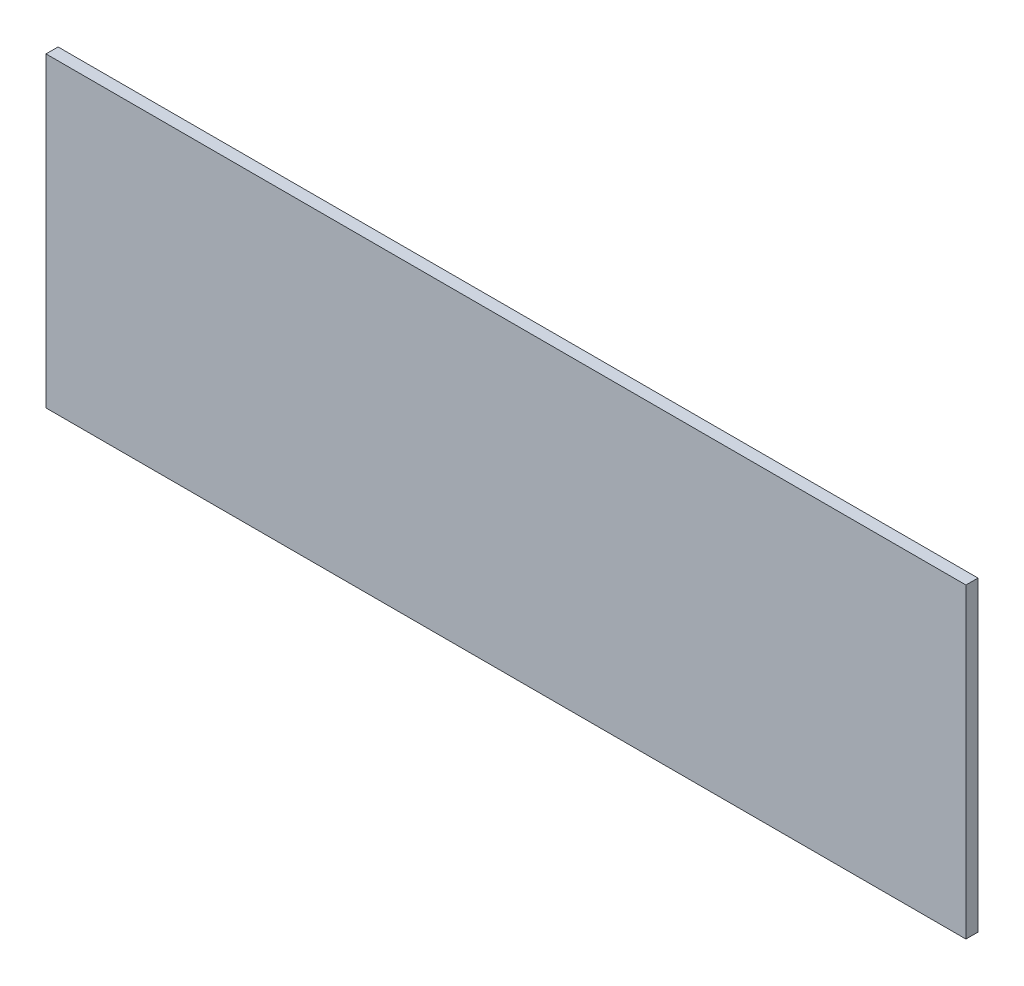
ISO-10303-21;
HEADER;
FILE_DESCRIPTION(('STEP AP214'),'2;1');
FILE_NAME('part.step','',(''),(''),'','','');
FILE_SCHEMA(('AUTOMOTIVE_DESIGN { 1 0 10303 214 1 1 1 1 }'));
ENDSEC;
DATA;
#1=APPLICATION_CONTEXT('core data for automotive mechanical design processes');
#2=APPLICATION_PROTOCOL_DEFINITION('international standard','automotive_design',2000,#1);
#3=PRODUCT_CONTEXT('',#1,'mechanical');
#4=PRODUCT('Part','Part','',(#3));
#5=PRODUCT_RELATED_PRODUCT_CATEGORY('part','',(#4));
#6=PRODUCT_DEFINITION_FORMATION('','',#4);
#7=PRODUCT_DEFINITION_CONTEXT('part definition',#1,'design');
#8=PRODUCT_DEFINITION('design','',#6,#7);
#9=PRODUCT_DEFINITION_SHAPE('','',#8);
#10=(LENGTH_UNIT() NAMED_UNIT(*) SI_UNIT(.MILLI.,.METRE.));
#11=(NAMED_UNIT(*) PLANE_ANGLE_UNIT() SI_UNIT($,.RADIAN.));
#12=(NAMED_UNIT(*) SI_UNIT($,.STERADIAN.) SOLID_ANGLE_UNIT());
#13=UNCERTAINTY_MEASURE_WITH_UNIT(LENGTH_MEASURE(1.E-05),#10,'distance_accuracy_value','');
#14=(GEOMETRIC_REPRESENTATION_CONTEXT(3) GLOBAL_UNCERTAINTY_ASSIGNED_CONTEXT((#13)) GLOBAL_UNIT_ASSIGNED_CONTEXT((#10,
#11,#12)) REPRESENTATION_CONTEXT('',''));
#15=CARTESIAN_POINT('',(0.,0.,0.));
#16=DIRECTION('',(0.,0.,1.));
#17=DIRECTION('',(1.,0.,0.));
#18=AXIS2_PLACEMENT_3D('',#15,#16,#17);
#19=CARTESIAN_POINT('',(0.,0.,1.));
#20=DIRECTION('',(1.,0.,0.));
#21=DIRECTION('',(0.,0.,-1.));
#22=AXIS2_PLACEMENT_3D('',#19,#20,#21);
#23=PLANE('',#22);
#24=DIRECTION('',(0.,-1.,0.));
#25=VECTOR('',#24,1.);
#26=CARTESIAN_POINT('',(0.,0.,0.));
#27=LINE('',#26,#25);
#28=CARTESIAN_POINT('',(0.,25.4,0.));
#29=VERTEX_POINT('',#28);
#30=CARTESIAN_POINT('',(0.,0.,0.));
#31=VERTEX_POINT('',#30);
#32=EDGE_CURVE('E98',#29,#31,#27,.T.);
#33=ORIENTED_EDGE('',*,*,#32,.T.);
#34=DIRECTION('',(0.,0.,-1.));
#35=VECTOR('',#34,1.);
#36=CARTESIAN_POINT('',(0.,0.,1.));
#37=LINE('',#36,#35);
#38=CARTESIAN_POINT('',(0.,0.,1.));
#39=VERTEX_POINT('',#38);
#40=EDGE_CURVE('E11',#39,#31,#37,.T.);
#41=ORIENTED_EDGE('',*,*,#40,.F.);
#42=DIRECTION('',(0.,-1.,0.));
#43=VECTOR('',#42,1.);
#44=CARTESIAN_POINT('',(0.,0.,1.));
#45=LINE('',#44,#43);
#46=CARTESIAN_POINT('',(0.,25.4,1.));
#47=VERTEX_POINT('',#46);
#48=EDGE_CURVE('E86',#47,#39,#45,.T.);
#49=ORIENTED_EDGE('',*,*,#48,.F.);
#50=DIRECTION('',(0.,0.,-1.));
#51=VECTOR('',#50,1.);
#52=CARTESIAN_POINT('',(0.,25.4,1.));
#53=LINE('',#52,#51);
#54=EDGE_CURVE('E94',#47,#29,#53,.T.);
#55=ORIENTED_EDGE('',*,*,#54,.T.);
#56=EDGE_LOOP('',(#33,#41,#49,#55));
#57=FACE_BOUND('',#56,.T.);
#58=ADVANCED_FACE('F35',(#57),#23,.F.);
#59=CARTESIAN_POINT('',(0.,0.,1.));
#60=DIRECTION('',(0.,1.,0.));
#61=DIRECTION('',(0.,0.,1.));
#62=AXIS2_PLACEMENT_3D('',#59,#60,#61);
#63=PLANE('',#62);
#64=DIRECTION('',(1.,0.,0.));
#65=VECTOR('',#64,1.);
#66=CARTESIAN_POINT('',(0.,0.,0.));
#67=LINE('',#66,#65);
#68=CARTESIAN_POINT('',(76.2,0.,0.));
#69=VERTEX_POINT('',#68);
#70=EDGE_CURVE('E90',#31,#69,#67,.T.);
#71=ORIENTED_EDGE('',*,*,#70,.T.);
#72=DIRECTION('',(0.,0.,-1.));
#73=VECTOR('',#72,1.);
#74=CARTESIAN_POINT('',(76.2,0.,1.));
#75=LINE('',#74,#73);
#76=CARTESIAN_POINT('',(76.2,0.,1.));
#77=VERTEX_POINT('',#76);
#78=EDGE_CURVE('E43',#77,#69,#75,.T.);
#79=ORIENTED_EDGE('',*,*,#78,.F.);
#80=DIRECTION('',(1.,0.,0.));
#81=VECTOR('',#80,1.);
#82=CARTESIAN_POINT('',(0.,0.,1.));
#83=LINE('',#82,#81);
#84=EDGE_CURVE('E81',#39,#77,#83,.T.);
#85=ORIENTED_EDGE('',*,*,#84,.F.);
#86=ORIENTED_EDGE('',*,*,#40,.T.);
#87=EDGE_LOOP('',(#71,#79,#85,#86));
#88=FACE_BOUND('',#87,.T.);
#89=ADVANCED_FACE('F89',(#88),#63,.F.);
#90=CARTESIAN_POINT('',(76.2,0.,1.));
#91=DIRECTION('',(-1.,0.,0.));
#92=DIRECTION('',(0.,0.,1.));
#93=AXIS2_PLACEMENT_3D('',#90,#91,#92);
#94=PLANE('',#93);
#95=DIRECTION('',(0.,1.,0.));
#96=VECTOR('',#95,1.);
#97=CARTESIAN_POINT('',(76.2,0.,0.));
#98=LINE('',#97,#96);
#99=CARTESIAN_POINT('',(76.2,25.4,0.));
#100=VERTEX_POINT('',#99);
#101=EDGE_CURVE('E68',#69,#100,#98,.T.);
#102=ORIENTED_EDGE('',*,*,#101,.T.);
#103=DIRECTION('',(0.,0.,-1.));
#104=VECTOR('',#103,1.);
#105=CARTESIAN_POINT('',(76.2,25.4,1.));
#106=LINE('',#105,#104);
#107=CARTESIAN_POINT('',(76.2,25.4,1.));
#108=VERTEX_POINT('',#107);
#109=EDGE_CURVE('E91',#108,#100,#106,.T.);
#110=ORIENTED_EDGE('',*,*,#109,.F.);
#111=DIRECTION('',(0.,1.,0.));
#112=VECTOR('',#111,1.);
#113=CARTESIAN_POINT('',(76.2,0.,1.));
#114=LINE('',#113,#112);
#115=EDGE_CURVE('E84',#77,#108,#114,.T.);
#116=ORIENTED_EDGE('',*,*,#115,.F.);
#117=ORIENTED_EDGE('',*,*,#78,.T.);
#118=EDGE_LOOP('',(#102,#110,#116,#117));
#119=FACE_BOUND('',#118,.T.);
#120=ADVANCED_FACE('F92',(#119),#94,.F.);
#121=CARTESIAN_POINT('',(0.,25.4,1.));
#122=DIRECTION('',(0.,-1.,0.));
#123=DIRECTION('',(0.,0.,-1.));
#124=AXIS2_PLACEMENT_3D('',#121,#122,#123);
#125=PLANE('',#124);
#126=DIRECTION('',(-1.,0.,0.));
#127=VECTOR('',#126,1.);
#128=CARTESIAN_POINT('',(0.,25.4,0.));
#129=LINE('',#128,#127);
#130=EDGE_CURVE('E74',#100,#29,#129,.T.);
#131=ORIENTED_EDGE('',*,*,#130,.T.);
#132=ORIENTED_EDGE('',*,*,#54,.F.);
#133=DIRECTION('',(-1.,0.,0.));
#134=VECTOR('',#133,1.);
#135=CARTESIAN_POINT('',(0.,25.4,1.));
#136=LINE('',#135,#134);
#137=EDGE_CURVE('E51',#108,#47,#136,.T.);
#138=ORIENTED_EDGE('',*,*,#137,.F.);
#139=ORIENTED_EDGE('',*,*,#109,.T.);
#140=EDGE_LOOP('',(#131,#132,#138,#139));
#141=FACE_BOUND('',#140,.T.);
#142=ADVANCED_FACE('F105',(#141),#125,.F.);
#143=CARTESIAN_POINT('',(0.,0.,1.));
#144=DIRECTION('',(0.,0.,-1.));
#145=DIRECTION('',(-1.,0.,0.));
#146=AXIS2_PLACEMENT_3D('',#143,#144,#145);
#147=PLANE('',#146);
#148=ORIENTED_EDGE('',*,*,#48,.T.);
#149=ORIENTED_EDGE('',*,*,#84,.T.);
#150=ORIENTED_EDGE('',*,*,#115,.T.);
#151=ORIENTED_EDGE('',*,*,#137,.T.);
#152=EDGE_LOOP('',(#148,#149,#150,#151));
#153=FACE_BOUND('',#152,.T.);
#154=ADVANCED_FACE('F82',(#153),#147,.F.);
#155=CARTESIAN_POINT('',(0.,0.,0.));
#156=DIRECTION('',(0.,0.,-1.));
#157=DIRECTION('',(-1.,0.,0.));
#158=AXIS2_PLACEMENT_3D('',#155,#156,#157);
#159=PLANE('',#158);
#160=ORIENTED_EDGE('',*,*,#32,.F.);
#161=ORIENTED_EDGE('',*,*,#130,.F.);
#162=ORIENTED_EDGE('',*,*,#101,.F.);
#163=ORIENTED_EDGE('',*,*,#70,.F.);
#164=EDGE_LOOP('',(#160,#161,#162,#163));
#165=FACE_BOUND('',#164,.T.);
#166=ADVANCED_FACE('F108',(#165),#159,.T.);
#167=CLOSED_SHELL('',(#58,#89,#120,#142,#154,#166));
#168=MANIFOLD_SOLID_BREP('B2',#167);
#169=ADVANCED_BREP_SHAPE_REPRESENTATION('',(#18,#168),#14);
#170=SHAPE_DEFINITION_REPRESENTATION(#9,#169);
ENDSEC;
END-ISO-10303-21;
